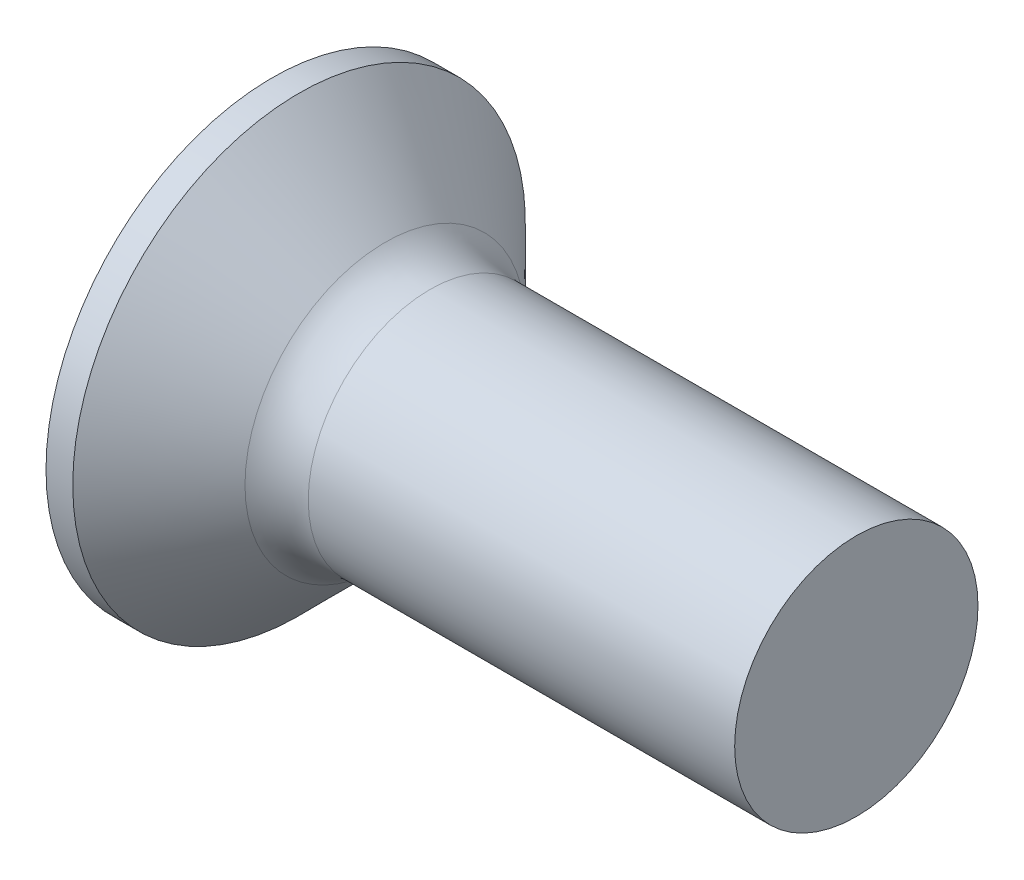
ISO-10303-21;
HEADER;
FILE_DESCRIPTION(('STEP AP214'),'2;1');
FILE_NAME('part.step','',(''),(''),'','','');
FILE_SCHEMA(('AUTOMOTIVE_DESIGN { 1 0 10303 214 1 1 1 1 }'));
ENDSEC;
DATA;
#1=APPLICATION_CONTEXT('core data for automotive mechanical design processes');
#2=APPLICATION_PROTOCOL_DEFINITION('international standard','automotive_design',2000,#1);
#3=PRODUCT_CONTEXT('',#1,'mechanical');
#4=PRODUCT('Part','Part','',(#3));
#5=PRODUCT_RELATED_PRODUCT_CATEGORY('part','',(#4));
#6=PRODUCT_DEFINITION_FORMATION('','',#4);
#7=PRODUCT_DEFINITION_CONTEXT('part definition',#1,'design');
#8=PRODUCT_DEFINITION('design','',#6,#7);
#9=PRODUCT_DEFINITION_SHAPE('','',#8);
#10=(LENGTH_UNIT() NAMED_UNIT(*) SI_UNIT(.MILLI.,.METRE.));
#11=(NAMED_UNIT(*) PLANE_ANGLE_UNIT() SI_UNIT($,.RADIAN.));
#12=(NAMED_UNIT(*) SI_UNIT($,.STERADIAN.) SOLID_ANGLE_UNIT());
#13=UNCERTAINTY_MEASURE_WITH_UNIT(LENGTH_MEASURE(1.E-05),#10,'distance_accuracy_value','');
#14=(GEOMETRIC_REPRESENTATION_CONTEXT(3) GLOBAL_UNCERTAINTY_ASSIGNED_CONTEXT((#13)) GLOBAL_UNIT_ASSIGNED_CONTEXT((#10,
#11,#12)) REPRESENTATION_CONTEXT('',''));
#15=CARTESIAN_POINT('',(0.,0.,0.));
#16=DIRECTION('',(0.,0.,1.));
#17=DIRECTION('',(1.,0.,0.));
#18=AXIS2_PLACEMENT_3D('',#15,#16,#17);
#19=CARTESIAN_POINT('',(0.,0.,0.));
#20=DIRECTION('',(-1.,0.,0.));
#21=DIRECTION('',(0.,0.,1.));
#22=AXIS2_PLACEMENT_3D('',#19,#20,#21);
#23=PLANE('',#22);
#24=CARTESIAN_POINT('',(0.,0.,0.));
#25=DIRECTION('',(-1.,0.,0.));
#26=DIRECTION('',(0.,0.,1.));
#27=AXIS2_PLACEMENT_3D('',#24,#25,#26);
#28=CIRCLE('',#27,4.65);
#29=CARTESIAN_POINT('',(0.,0.,4.65));
#30=VERTEX_POINT('',#29);
#31=EDGE_CURVE('E326',#30,#30,#28,.T.);
#32=ORIENTED_EDGE('',*,*,#31,.T.);
#33=EDGE_LOOP('',(#32));
#34=FACE_BOUND('',#33,.T.);
#35=DIRECTION('',(0.,0.,-1.));
#36=VECTOR('',#35,1.);
#37=CARTESIAN_POINT('',(0.,-0.515000000000008,2.45));
#38=LINE('',#37,#36);
#39=CARTESIAN_POINT('',(0.,-0.515000000000008,2.45));
#40=VERTEX_POINT('',#39);
#41=CARTESIAN_POINT('',(0.,-0.515000000000003,0.931375357653025));
#42=VERTEX_POINT('',#41);
#43=EDGE_CURVE('E347',#40,#42,#38,.T.);
#44=ORIENTED_EDGE('',*,*,#43,.T.);
#45=CARTESIAN_POINT('',(0.,0.,0.));
#46=DIRECTION('',(-1.,0.,0.));
#47=DIRECTION('',(0.,0.,1.));
#48=AXIS2_PLACEMENT_3D('',#45,#46,#47);
#49=CIRCLE('',#48,1.06427677642768);
#50=CARTESIAN_POINT('',(0.,-0.931375357653026,0.515));
#51=VERTEX_POINT('',#50);
#52=EDGE_CURVE('E419',#51,#42,#49,.T.);
#53=ORIENTED_EDGE('',*,*,#52,.F.);
#54=DIRECTION('',(0.,-1.,0.));
#55=VECTOR('',#54,1.);
#56=CARTESIAN_POINT('',(0.,2.45,0.515));
#57=LINE('',#56,#55);
#58=CARTESIAN_POINT('',(0.,-2.45,0.515));
#59=VERTEX_POINT('',#58);
#60=EDGE_CURVE('E298',#51,#59,#57,.T.);
#61=ORIENTED_EDGE('',*,*,#60,.T.);
#62=DIRECTION('',(0.,0.,-1.));
#63=VECTOR('',#62,1.);
#64=CARTESIAN_POINT('',(0.,-2.45,0.515));
#65=LINE('',#64,#63);
#66=CARTESIAN_POINT('',(0.,-2.45,-0.515));
#67=VERTEX_POINT('',#66);
#68=EDGE_CURVE('E281',#59,#67,#65,.T.);
#69=ORIENTED_EDGE('',*,*,#68,.T.);
#70=DIRECTION('',(0.,1.,0.));
#71=VECTOR('',#70,1.);
#72=CARTESIAN_POINT('',(0.,-2.45,-0.515));
#73=LINE('',#72,#71);
#74=CARTESIAN_POINT('',(0.,-0.931375357653026,-0.515));
#75=VERTEX_POINT('',#74);
#76=EDGE_CURVE('E290',#67,#75,#73,.T.);
#77=ORIENTED_EDGE('',*,*,#76,.T.);
#78=CARTESIAN_POINT('',(0.,-0.514999999999997,-0.931375357653028));
#79=VERTEX_POINT('',#78);
#80=EDGE_CURVE('E404',#79,#75,#49,.T.);
#81=ORIENTED_EDGE('',*,*,#80,.F.);
#82=CARTESIAN_POINT('',(0.,-0.514999999999992,-2.45));
#83=VERTEX_POINT('',#82);
#84=EDGE_CURVE('E351',#79,#83,#38,.T.);
#85=ORIENTED_EDGE('',*,*,#84,.T.);
#86=DIRECTION('',(0.,1.,0.));
#87=VECTOR('',#86,1.);
#88=CARTESIAN_POINT('',(0.,-0.514999999999992,-2.45));
#89=LINE('',#88,#87);
#90=CARTESIAN_POINT('',(0.,0.515000000000009,-2.45));
#91=VERTEX_POINT('',#90);
#92=EDGE_CURVE('E340',#83,#91,#89,.T.);
#93=ORIENTED_EDGE('',*,*,#92,.T.);
#94=DIRECTION('',(0.,0.,1.));
#95=VECTOR('',#94,1.);
#96=CARTESIAN_POINT('',(0.,0.515000000000009,-2.45));
#97=LINE('',#96,#95);
#98=CARTESIAN_POINT('',(0.,0.515000000000003,-0.931375357653025));
#99=VERTEX_POINT('',#98);
#100=EDGE_CURVE('E355',#91,#99,#97,.T.);
#101=ORIENTED_EDGE('',*,*,#100,.T.);
#102=CARTESIAN_POINT('',(0.,0.931375357653026,-0.515));
#103=VERTEX_POINT('',#102);
#104=EDGE_CURVE('E417',#103,#99,#49,.T.);
#105=ORIENTED_EDGE('',*,*,#104,.F.);
#106=CARTESIAN_POINT('',(0.,2.45,-0.515));
#107=VERTEX_POINT('',#106);
#108=EDGE_CURVE('E293',#103,#107,#73,.T.);
#109=ORIENTED_EDGE('',*,*,#108,.T.);
#110=DIRECTION('',(0.,0.,1.));
#111=VECTOR('',#110,1.);
#112=CARTESIAN_POINT('',(0.,2.45,-0.515));
#113=LINE('',#112,#111);
#114=CARTESIAN_POINT('',(0.,2.45,0.515));
#115=VERTEX_POINT('',#114);
#116=EDGE_CURVE('E292',#107,#115,#113,.T.);
#117=ORIENTED_EDGE('',*,*,#116,.T.);
#118=CARTESIAN_POINT('',(0.,0.931375357653027,0.515));
#119=VERTEX_POINT('',#118);
#120=EDGE_CURVE('E300',#115,#119,#57,.T.);
#121=ORIENTED_EDGE('',*,*,#120,.T.);
#122=CARTESIAN_POINT('',(0.,0.514999999999997,0.931375357653028));
#123=VERTEX_POINT('',#122);
#124=EDGE_CURVE('E418',#123,#119,#49,.T.);
#125=ORIENTED_EDGE('',*,*,#124,.F.);
#126=CARTESIAN_POINT('',(0.,0.514999999999991,2.45));
#127=VERTEX_POINT('',#126);
#128=EDGE_CURVE('E358',#123,#127,#97,.T.);
#129=ORIENTED_EDGE('',*,*,#128,.T.);
#130=DIRECTION('',(0.,-1.,0.));
#131=VECTOR('',#130,1.);
#132=CARTESIAN_POINT('',(0.,0.514999999999991,2.45));
#133=LINE('',#132,#131);
#134=EDGE_CURVE('E357',#127,#40,#133,.T.);
#135=ORIENTED_EDGE('',*,*,#134,.T.);
#136=EDGE_LOOP('',(#44,#53,#61,#69,#77,#81,#85,#93,#101,#105,#109,#117,#121,#125,#129,#135));
#137=FACE_BOUND('',#136,.T.);
#138=ADVANCED_FACE('F35',(#34,#137),#23,.T.);
#139=CARTESIAN_POINT('',(3.05,-0.929326147908032,0.515));
#140=DIRECTION('',(0.,0.,-1.));
#141=DIRECTION('',(0.,1.,0.));
#142=AXIS2_PLACEMENT_3D('',#139,#140,#141);
#143=PLANE('',#142);
#144=ORIENTED_EDGE('',*,*,#60,.F.);
#145=CARTESIAN_POINT('',(-1.54221347305349,-1.05291860734043,0.515));
#146=CARTESIAN_POINT('',(-1.22007147016316,-1.02783607001973,0.515));
#147=CARTESIAN_POINT('',(-0.89794181675164,-1.002592893973,0.515));
#148=CARTESIAN_POINT('',(-0.253713842852045,-0.951673528807875,0.515));
#149=CARTESIAN_POINT('',(0.0683844773279264,-0.925997335794192,0.515));
#150=CARTESIAN_POINT('',(0.712537341146252,-0.874100649412192,0.515));
#151=CARTESIAN_POINT('',(1.03459188478602,-0.847880156061489,0.515));
#152=CARTESIAN_POINT('',(1.67864013954242,-0.794723210967585,0.515));
#153=CARTESIAN_POINT('',(2.0006338510091,-0.767786763479056,0.515));
#154=CARTESIAN_POINT('',(2.56056239677505,-0.720091607539809,0.515));
#155=CARTESIAN_POINT('',(2.7985160340986,-0.699554136185312,0.515));
#156=CARTESIAN_POINT('',(3.27436149939218,-0.657782810112313,0.515));
#157=CARTESIAN_POINT('',(3.51225332755344,-0.636548957574876,0.515));
#158=CARTESIAN_POINT('',(3.98796007755392,-0.59316517097504,0.515));
#159=CARTESIAN_POINT('',(4.22577499737104,-0.571015214531953,0.515));
#160=CARTESIAN_POINT('',(4.70127802763926,-0.525368927832394,0.515));
#161=CARTESIAN_POINT('',(4.93896613655203,-0.501872581601751,0.515));
#162=CARTESIAN_POINT('',(5.17656597464715,-0.477487906778812,0.515));
#163=B_SPLINE_CURVE_WITH_KNOTS('',3,(#145,#146,#147,#148,#149,#150,#151,#152,#153,#154,#155,
#156,#157,#158,#159,#160,#161,#162),.UNSPECIFIED.,.F.,.F.,(4,2,2,2,2,2,2,2,4),(0.,
0.969351235948301,1.93871119655371,2.90807112578744,3.87742529573196,4.59393929763426,
5.3104510556289,6.0269803285681,6.74351810449256),.UNSPECIFIED.);
#164=CARTESIAN_POINT('',(3.05,-0.677477674908922,0.515));
#165=VERTEX_POINT('',#164);
#166=EDGE_CURVE('E395',#51,#165,#163,.T.);
#167=ORIENTED_EDGE('',*,*,#166,.T.);
#168=DIRECTION('',(0.,-1.,0.));
#169=VECTOR('',#168,1.);
#170=CARTESIAN_POINT('',(3.05,0.929326147908032,0.515));
#171=LINE('',#170,#169);
#172=CARTESIAN_POINT('',(3.05,-0.929326147908032,0.515));
#173=VERTEX_POINT('',#172);
#174=EDGE_CURVE('E316',#165,#173,#171,.T.);
#175=ORIENTED_EDGE('',*,*,#174,.T.);
#176=DIRECTION('',(0.89493436774996,0.446197800778958,0.));
#177=VECTOR('',#176,1.);
#178=CARTESIAN_POINT('',(0.,-2.45,0.515));
#179=LINE('',#178,#177);
#180=EDGE_CURVE('E287',#59,#173,#179,.T.);
#181=ORIENTED_EDGE('',*,*,#180,.F.);
#182=EDGE_LOOP('',(#144,#167,#175,#181));
#183=FACE_BOUND('',#182,.T.);
#184=ADVANCED_FACE('F167',(#183),#143,.T.);
#185=CARTESIAN_POINT('',(3.05,0.929326147908032,0.515));
#186=VERTEX_POINT('',#185);
#187=CARTESIAN_POINT('',(3.05,0.677477674908922,0.515));
#188=VERTEX_POINT('',#187);
#189=EDGE_CURVE('E318',#186,#188,#171,.T.);
#190=ORIENTED_EDGE('',*,*,#189,.T.);
#191=CARTESIAN_POINT('',(-1.54221347305349,1.05291860734043,0.515));
#192=CARTESIAN_POINT('',(-1.22007147016316,1.02783607001973,0.515));
#193=CARTESIAN_POINT('',(-0.89794181675164,1.002592893973,0.515));
#194=CARTESIAN_POINT('',(-0.253713842852044,0.951673528807875,0.515));
#195=CARTESIAN_POINT('',(0.068384477327927,0.925997335794193,0.515));
#196=CARTESIAN_POINT('',(0.712537341146252,0.874100649412192,0.515));
#197=CARTESIAN_POINT('',(1.03459188478602,0.84788015606149,0.515));
#198=CARTESIAN_POINT('',(1.67864013954242,0.794723210967586,0.515));
#199=CARTESIAN_POINT('',(2.0006338510091,0.767786763479056,0.515));
#200=CARTESIAN_POINT('',(2.56056239677505,0.720091607539809,0.515));
#201=CARTESIAN_POINT('',(2.7985160340986,0.699554136185312,0.515));
#202=CARTESIAN_POINT('',(3.27436149939218,0.657782810112313,0.515));
#203=CARTESIAN_POINT('',(3.51225332755344,0.636548957574876,0.515));
#204=CARTESIAN_POINT('',(3.98796007755392,0.59316517097504,0.515));
#205=CARTESIAN_POINT('',(4.22577499737104,0.571015214531953,0.515));
#206=CARTESIAN_POINT('',(4.70127802763926,0.525368927832394,0.515));
#207=CARTESIAN_POINT('',(4.93896613655203,0.501872581601751,0.515));
#208=CARTESIAN_POINT('',(5.17656597464715,0.477487906778812,0.515));
#209=B_SPLINE_CURVE_WITH_KNOTS('',3,(#191,#192,#193,#194,#195,#196,#197,#198,#199,#200,#201,
#202,#203,#204,#205,#206,#207,#208),.UNSPECIFIED.,.F.,.F.,(4,2,2,2,2,2,2,2,4),(0.,
0.969351235948301,1.93871119655371,2.90807112578744,3.87742529573196,4.59393929763426,
5.3104510556289,6.0269803285681,6.74351810449256),.UNSPECIFIED.);
#210=EDGE_CURVE('E227',#188,#119,#209,.F.);
#211=ORIENTED_EDGE('',*,*,#210,.T.);
#212=ORIENTED_EDGE('',*,*,#120,.F.);
#213=DIRECTION('',(0.89493436774996,-0.446197800778958,0.));
#214=VECTOR('',#213,1.);
#215=CARTESIAN_POINT('',(0.,2.45,0.515));
#216=LINE('',#215,#214);
#217=EDGE_CURVE('E63',#115,#186,#216,.T.);
#218=ORIENTED_EDGE('',*,*,#217,.T.);
#219=EDGE_LOOP('',(#190,#211,#212,#218));
#220=FACE_BOUND('',#219,.T.);
#221=ADVANCED_FACE('F172',(#220),#143,.T.);
#222=CARTESIAN_POINT('',(3.05,0.929326147908032,-0.515));
#223=DIRECTION('',(0.,0.,1.));
#224=DIRECTION('',(1.,0.,0.));
#225=AXIS2_PLACEMENT_3D('',#222,#223,#224);
#226=PLANE('',#225);
#227=DIRECTION('',(0.,1.,0.));
#228=VECTOR('',#227,1.);
#229=CARTESIAN_POINT('',(3.05,-0.929326147908032,-0.515));
#230=LINE('',#229,#228);
#231=CARTESIAN_POINT('',(3.05,-0.929326147908032,-0.515));
#232=VERTEX_POINT('',#231);
#233=CARTESIAN_POINT('',(3.05,-0.677477674908922,-0.515));
#234=VERTEX_POINT('',#233);
#235=EDGE_CURVE('E317',#232,#234,#230,.T.);
#236=ORIENTED_EDGE('',*,*,#235,.T.);
#237=CARTESIAN_POINT('',(-1.54221347058903,-1.05291860714859,-0.515));
#238=CARTESIAN_POINT('',(-1.22007146800241,-1.02783606985067,-0.515));
#239=CARTESIAN_POINT('',(-0.897941814894598,-1.00259289382691,-0.515));
#240=CARTESIAN_POINT('',(-0.253713841602368,-0.951673528708394,-0.515));
#241=CARTESIAN_POINT('',(0.0683844782739385,-0.925997335718345,-0.515));
#242=CARTESIAN_POINT('',(0.712537341258934,-0.874100649402747,-0.515));
#243=CARTESIAN_POINT('',(1.03459188436907,-0.847880156095195,-0.515));
#244=CARTESIAN_POINT('',(1.67864013806642,-0.794723211090119,-0.515));
#245=CARTESIAN_POINT('',(2.00063384900369,-0.767786763647266,-0.515));
#246=CARTESIAN_POINT('',(2.56056239424054,-0.720091607757629,-0.515));
#247=CARTESIAN_POINT('',(2.79851603156427,-0.699554136405275,-0.515));
#248=CARTESIAN_POINT('',(3.27436149685826,-0.657782810337245,-0.515));
#249=CARTESIAN_POINT('',(3.51225332501977,-0.636548957802634,-0.515));
#250=CARTESIAN_POINT('',(3.98796007502083,-0.593165171209449,-0.515));
#251=CARTESIAN_POINT('',(4.22577499483828,-0.571015214770186,-0.515));
#252=CARTESIAN_POINT('',(4.70127802510735,-0.525368928080089,-0.515));
#253=CARTESIAN_POINT('',(4.93896613402064,-0.501872581855082,-0.515));
#254=CARTESIAN_POINT('',(5.17656597211643,-0.477487907039094,-0.515));
#255=B_SPLINE_CURVE_WITH_KNOTS('',3,(#237,#238,#239,#240,#241,#242,#243,#244,#245,#246,#247,
#248,#249,#250,#251,#252,#253,#254),.UNSPECIFIED.,.F.,.F.,(4,2,2,2,2,2,2,2,4),(0.,
0.969351235034601,1.93871119472626,2.90807112236582,3.87742529071622,4.59393929261848,
5.3104510506131,6.02698032355223,6.74351809947659),.UNSPECIFIED.);
#256=EDGE_CURVE('E221',#234,#75,#255,.F.);
#257=ORIENTED_EDGE('',*,*,#256,.T.);
#258=ORIENTED_EDGE('',*,*,#76,.F.);
#259=DIRECTION('',(0.89493436774996,0.446197800778958,0.));
#260=VECTOR('',#259,1.);
#261=CARTESIAN_POINT('',(0.,-2.45,-0.515));
#262=LINE('',#261,#260);
#263=EDGE_CURVE('E277',#67,#232,#262,.T.);
#264=ORIENTED_EDGE('',*,*,#263,.T.);
#265=EDGE_LOOP('',(#236,#257,#258,#264));
#266=FACE_BOUND('',#265,.T.);
#267=ADVANCED_FACE('F207',(#266),#226,.T.);
#268=ORIENTED_EDGE('',*,*,#108,.F.);
#269=CARTESIAN_POINT('',(-1.54221347058903,1.05291860714859,-0.515));
#270=CARTESIAN_POINT('',(-1.22007146800241,1.02783606985067,-0.515));
#271=CARTESIAN_POINT('',(-0.897941814894599,1.00259289382691,-0.515));
#272=CARTESIAN_POINT('',(-0.253713841602368,0.951673528708394,-0.515));
#273=CARTESIAN_POINT('',(0.0683844782739385,0.925997335718345,-0.515));
#274=CARTESIAN_POINT('',(0.712537341258934,0.874100649402747,-0.515));
#275=CARTESIAN_POINT('',(1.03459188436907,0.847880156095195,-0.515));
#276=CARTESIAN_POINT('',(1.67864013806642,0.794723211090119,-0.515));
#277=CARTESIAN_POINT('',(2.00063384900369,0.767786763647266,-0.515));
#278=CARTESIAN_POINT('',(2.56056239424054,0.720091607757629,-0.515));
#279=CARTESIAN_POINT('',(2.79851603156427,0.699554136405275,-0.515));
#280=CARTESIAN_POINT('',(3.27436149685826,0.657782810337245,-0.515));
#281=CARTESIAN_POINT('',(3.51225332501977,0.636548957802634,-0.515));
#282=CARTESIAN_POINT('',(3.98796007502083,0.593165171209449,-0.515));
#283=CARTESIAN_POINT('',(4.22577499483828,0.571015214770186,-0.515));
#284=CARTESIAN_POINT('',(4.70127802510735,0.525368928080089,-0.515));
#285=CARTESIAN_POINT('',(4.93896613402064,0.501872581855082,-0.515));
#286=CARTESIAN_POINT('',(5.17656597211643,0.477487907039095,-0.515));
#287=B_SPLINE_CURVE_WITH_KNOTS('',3,(#269,#270,#271,#272,#273,#274,#275,#276,#277,#278,#279,
#280,#281,#282,#283,#284,#285,#286),.UNSPECIFIED.,.F.,.F.,(4,2,2,2,2,2,2,2,4),(0.,
0.9693512350346,1.93871119472626,2.90807112236583,3.87742529071622,4.59393929261848,
5.3104510506131,6.02698032355223,6.74351809947659),.UNSPECIFIED.);
#288=CARTESIAN_POINT('',(3.05,0.677477674908922,-0.515));
#289=VERTEX_POINT('',#288);
#290=EDGE_CURVE('E215',#103,#289,#287,.T.);
#291=ORIENTED_EDGE('',*,*,#290,.T.);
#292=CARTESIAN_POINT('',(3.05,0.929326147908032,-0.515));
#293=VERTEX_POINT('',#292);
#294=EDGE_CURVE('E322',#289,#293,#230,.T.);
#295=ORIENTED_EDGE('',*,*,#294,.T.);
#296=DIRECTION('',(0.89493436774996,-0.446197800778958,0.));
#297=VECTOR('',#296,1.);
#298=CARTESIAN_POINT('',(0.,2.45,-0.515));
#299=LINE('',#298,#297);
#300=EDGE_CURVE('E311',#107,#293,#299,.T.);
#301=ORIENTED_EDGE('',*,*,#300,.F.);
#302=EDGE_LOOP('',(#268,#291,#295,#301));
#303=FACE_BOUND('',#302,.T.);
#304=ADVANCED_FACE('F199',(#303),#226,.T.);
#305=CARTESIAN_POINT('',(3.05,0.929326147908032,-0.515));
#306=DIRECTION('',(1.,0.,0.));
#307=DIRECTION('',(0.,0.,-1.));
#308=AXIS2_PLACEMENT_3D('',#305,#306,#307);
#309=PLANE('',#308);
#310=CARTESIAN_POINT('',(3.05,0.,0.));
#311=DIRECTION('',(-1.,0.,0.));
#312=DIRECTION('',(0.,0.,1.));
#313=AXIS2_PLACEMENT_3D('',#310,#311,#312);
#314=CIRCLE('',#313,0.851);
#315=EDGE_CURVE('E426',#234,#165,#314,.T.);
#316=ORIENTED_EDGE('',*,*,#315,.F.);
#317=ORIENTED_EDGE('',*,*,#235,.F.);
#318=DIRECTION('',(0.,0.,-1.));
#319=VECTOR('',#318,1.);
#320=CARTESIAN_POINT('',(3.05,-0.929326147908032,0.515));
#321=LINE('',#320,#319);
#322=EDGE_CURVE('E284',#173,#232,#321,.T.);
#323=ORIENTED_EDGE('',*,*,#322,.F.);
#324=ORIENTED_EDGE('',*,*,#174,.F.);
#325=EDGE_LOOP('',(#316,#317,#323,#324));
#326=FACE_BOUND('',#325,.T.);
#327=ADVANCED_FACE('F195',(#326),#309,.F.);
#328=CARTESIAN_POINT('',(3.05,-0.515000000000002,0.67747767490892));
#329=VERTEX_POINT('',#328);
#330=CARTESIAN_POINT('',(3.05,0.514999999999998,0.677477674908923));
#331=VERTEX_POINT('',#330);
#332=EDGE_CURVE('E421',#329,#331,#314,.T.);
#333=ORIENTED_EDGE('',*,*,#332,.F.);
#334=DIRECTION('',(0.,0.,-1.));
#335=VECTOR('',#334,1.);
#336=CARTESIAN_POINT('',(3.05,-0.515000000000003,0.92932614790803));
#337=LINE('',#336,#335);
#338=CARTESIAN_POINT('',(3.05,-0.515000000000003,0.92932614790803));
#339=VERTEX_POINT('',#338);
#340=EDGE_CURVE('E376',#339,#329,#337,.T.);
#341=ORIENTED_EDGE('',*,*,#340,.F.);
#342=DIRECTION('',(0.,-1.,0.));
#343=VECTOR('',#342,1.);
#344=CARTESIAN_POINT('',(3.05,0.514999999999997,0.929326147908034));
#345=LINE('',#344,#343);
#346=CARTESIAN_POINT('',(3.05,0.514999999999997,0.929326147908034));
#347=VERTEX_POINT('',#346);
#348=EDGE_CURVE('E371',#347,#339,#345,.T.);
#349=ORIENTED_EDGE('',*,*,#348,.F.);
#350=DIRECTION('',(0.,0.,1.));
#351=VECTOR('',#350,1.);
#352=CARTESIAN_POINT('',(3.05,0.515000000000003,-0.92932614790803));
#353=LINE('',#352,#351);
#354=EDGE_CURVE('E381',#331,#347,#353,.T.);
#355=ORIENTED_EDGE('',*,*,#354,.F.);
#356=EDGE_LOOP('',(#333,#341,#349,#355));
#357=FACE_BOUND('',#356,.T.);
#358=ADVANCED_FACE('F198',(#357),#309,.F.);
#359=EDGE_CURVE('E392',#188,#289,#314,.T.);
#360=ORIENTED_EDGE('',*,*,#359,.F.);
#361=ORIENTED_EDGE('',*,*,#189,.F.);
#362=DIRECTION('',(0.,0.,1.));
#363=VECTOR('',#362,1.);
#364=CARTESIAN_POINT('',(3.05,0.929326147908032,-0.515));
#365=LINE('',#364,#363);
#366=EDGE_CURVE('E314',#293,#186,#365,.T.);
#367=ORIENTED_EDGE('',*,*,#366,.F.);
#368=ORIENTED_EDGE('',*,*,#294,.F.);
#369=EDGE_LOOP('',(#360,#361,#367,#368));
#370=FACE_BOUND('',#369,.T.);
#371=ADVANCED_FACE('F389',(#370),#309,.F.);
#372=CARTESIAN_POINT('',(3.05,0.515000000000002,-0.67747767490892));
#373=VERTEX_POINT('',#372);
#374=CARTESIAN_POINT('',(3.05,-0.514999999999998,-0.677477674908924));
#375=VERTEX_POINT('',#374);
#376=EDGE_CURVE('E416',#373,#375,#314,.T.);
#377=ORIENTED_EDGE('',*,*,#376,.F.);
#378=CARTESIAN_POINT('',(3.05,0.515000000000003,-0.92932614790803));
#379=VERTEX_POINT('',#378);
#380=EDGE_CURVE('E375',#379,#373,#353,.T.);
#381=ORIENTED_EDGE('',*,*,#380,.F.);
#382=DIRECTION('',(0.,1.,0.));
#383=VECTOR('',#382,1.);
#384=CARTESIAN_POINT('',(3.05,-0.514999999999997,-0.929326147908034));
#385=LINE('',#384,#383);
#386=CARTESIAN_POINT('',(3.05,-0.514999999999997,-0.929326147908034));
#387=VERTEX_POINT('',#386);
#388=EDGE_CURVE('E370',#387,#379,#385,.T.);
#389=ORIENTED_EDGE('',*,*,#388,.F.);
#390=EDGE_CURVE('E374',#375,#387,#337,.T.);
#391=ORIENTED_EDGE('',*,*,#390,.F.);
#392=EDGE_LOOP('',(#377,#381,#389,#391));
#393=FACE_BOUND('',#392,.T.);
#394=ADVANCED_FACE('F201',(#393),#309,.F.);
#395=CARTESIAN_POINT('',(3.05,0.514999999999997,0.929326147908034));
#396=DIRECTION('',(0.,-1.,0.));
#397=DIRECTION('',(1.,0.,0.));
#398=AXIS2_PLACEMENT_3D('',#395,#396,#397);
#399=PLANE('',#398);
#400=ORIENTED_EDGE('',*,*,#380,.T.);
#401=CARTESIAN_POINT('',(-1.54221347058903,0.515000000000004,-1.05291860714859));
#402=CARTESIAN_POINT('',(-1.22007146800241,0.515000000000003,-1.02783606985067));
#403=CARTESIAN_POINT('',(-0.897941814894599,0.515000000000003,-1.00259289382691));
#404=CARTESIAN_POINT('',(-0.253713841602368,0.515000000000003,-0.951673528708393));
#405=CARTESIAN_POINT('',(0.0683844782739385,0.515000000000003,-0.925997335718343));
#406=CARTESIAN_POINT('',(0.712537341258934,0.515000000000003,-0.874100649402745));
#407=CARTESIAN_POINT('',(1.03459188436907,0.515000000000003,-0.847880156095194));
#408=CARTESIAN_POINT('',(1.67864013806642,0.515000000000003,-0.794723211090117));
#409=CARTESIAN_POINT('',(2.00063384900369,0.515000000000003,-0.767786763647265));
#410=CARTESIAN_POINT('',(2.56056239424054,0.515000000000003,-0.720091607757627));
#411=CARTESIAN_POINT('',(2.79851603156427,0.515000000000003,-0.699554136405273));
#412=CARTESIAN_POINT('',(3.27436149685826,0.515000000000002,-0.657782810337243));
#413=CARTESIAN_POINT('',(3.51225332501977,0.515000000000002,-0.636548957802633));
#414=CARTESIAN_POINT('',(3.98796007502083,0.515000000000002,-0.593165171209447));
#415=CARTESIAN_POINT('',(4.22577499483828,0.515000000000002,-0.571015214770184));
#416=CARTESIAN_POINT('',(4.70127802510735,0.515000000000002,-0.525368928080087));
#417=CARTESIAN_POINT('',(4.93896613402064,0.515000000000002,-0.50187258185508));
#418=CARTESIAN_POINT('',(5.17656597211643,0.515000000000002,-0.477487907039093));
#419=B_SPLINE_CURVE_WITH_KNOTS('',3,(#401,#402,#403,#404,#405,#406,#407,#408,#409,#410,#411,
#412,#413,#414,#415,#416,#417,#418),.UNSPECIFIED.,.F.,.F.,(4,2,2,2,2,2,2,2,4),(0.,
0.969351235034601,1.93871119472626,2.90807112236582,3.87742529071622,4.59393929261848,
5.3104510506131,6.02698032355223,6.74351809947659),.UNSPECIFIED.);
#420=EDGE_CURVE('E252',#373,#99,#419,.F.);
#421=ORIENTED_EDGE('',*,*,#420,.T.);
#422=ORIENTED_EDGE('',*,*,#100,.F.);
#423=DIRECTION('',(0.89493436774996,0.,0.446197800778958));
#424=VECTOR('',#423,1.);
#425=CARTESIAN_POINT('',(0.,0.515000000000009,-2.45));
#426=LINE('',#425,#424);
#427=EDGE_CURVE('E362',#91,#379,#426,.T.);
#428=ORIENTED_EDGE('',*,*,#427,.T.);
#429=EDGE_LOOP('',(#400,#421,#422,#428));
#430=FACE_BOUND('',#429,.T.);
#431=ADVANCED_FACE('F258',(#430),#399,.T.);
#432=CARTESIAN_POINT('',(3.05,-0.514999999999997,-0.929326147908034));
#433=DIRECTION('',(0.,1.,0.));
#434=DIRECTION('',(0.,0.,1.));
#435=AXIS2_PLACEMENT_3D('',#432,#433,#434);
#436=PLANE('',#435);
#437=ORIENTED_EDGE('',*,*,#84,.F.);
#438=CARTESIAN_POINT('',(-1.54221347305349,-0.514999999999996,-1.05291860734043));
#439=CARTESIAN_POINT('',(-1.22007147016316,-0.514999999999996,-1.02783607001974));
#440=CARTESIAN_POINT('',(-0.89794181675164,-0.514999999999997,-1.002592893973));
#441=CARTESIAN_POINT('',(-0.253713842852044,-0.514999999999997,-0.951673528807877));
#442=CARTESIAN_POINT('',(0.0683844773279268,-0.514999999999997,-0.925997335794194));
#443=CARTESIAN_POINT('',(0.712537341146252,-0.514999999999997,-0.874100649412194));
#444=CARTESIAN_POINT('',(1.03459188478602,-0.514999999999997,-0.847880156061491));
#445=CARTESIAN_POINT('',(1.67864013954242,-0.514999999999997,-0.794723210967587));
#446=CARTESIAN_POINT('',(2.0006338510091,-0.514999999999997,-0.767786763479058));
#447=CARTESIAN_POINT('',(2.56056239677505,-0.514999999999998,-0.72009160753981));
#448=CARTESIAN_POINT('',(2.7985160340986,-0.514999999999998,-0.699554136185314));
#449=CARTESIAN_POINT('',(3.27436149939218,-0.514999999999998,-0.657782810112315));
#450=CARTESIAN_POINT('',(3.51225332755344,-0.514999999999998,-0.636548957574878));
#451=CARTESIAN_POINT('',(3.98796007755392,-0.514999999999998,-0.593165170975042));
#452=CARTESIAN_POINT('',(4.22577499737104,-0.514999999999998,-0.571015214531955));
#453=CARTESIAN_POINT('',(4.70127802763926,-0.514999999999998,-0.525368927832396));
#454=CARTESIAN_POINT('',(4.93896613655203,-0.514999999999999,-0.501872581601752));
#455=CARTESIAN_POINT('',(5.17656597464715,-0.514999999999999,-0.477487906778814));
#456=B_SPLINE_CURVE_WITH_KNOTS('',3,(#438,#439,#440,#441,#442,#443,#444,#445,#446,#447,#448,
#449,#450,#451,#452,#453,#454,#455),.UNSPECIFIED.,.F.,.F.,(4,2,2,2,2,2,2,2,4),(0.,
0.969351235948301,1.93871119655371,2.90807112578744,3.87742529573196,4.59393929763426,
5.3104510556289,6.0269803285681,6.74351810449256),.UNSPECIFIED.);
#457=EDGE_CURVE('E247',#79,#375,#456,.T.);
#458=ORIENTED_EDGE('',*,*,#457,.T.);
#459=ORIENTED_EDGE('',*,*,#390,.T.);
#460=DIRECTION('',(0.89493436774996,0.,0.446197800778958));
#461=VECTOR('',#460,1.);
#462=CARTESIAN_POINT('',(0.,-0.514999999999992,-2.45));
#463=LINE('',#462,#461);
#464=EDGE_CURVE('E359',#83,#387,#463,.T.);
#465=ORIENTED_EDGE('',*,*,#464,.F.);
#466=EDGE_LOOP('',(#437,#458,#459,#465));
#467=FACE_BOUND('',#466,.T.);
#468=ADVANCED_FACE('F262',(#467),#436,.T.);
#469=ORIENTED_EDGE('',*,*,#340,.T.);
#470=CARTESIAN_POINT('',(-1.54221347305349,-0.515000000000003,1.05291860734043));
#471=CARTESIAN_POINT('',(-1.22007147016316,-0.515000000000003,1.02783607001973));
#472=CARTESIAN_POINT('',(-0.89794181675164,-0.515000000000003,1.002592893973));
#473=CARTESIAN_POINT('',(-0.253713842852045,-0.515000000000003,0.951673528807873));
#474=CARTESIAN_POINT('',(0.0683844773279266,-0.515000000000003,0.925997335794191));
#475=CARTESIAN_POINT('',(0.712537341146252,-0.515000000000003,0.87410064941219));
#476=CARTESIAN_POINT('',(1.03459188478602,-0.515000000000003,0.847880156061488));
#477=CARTESIAN_POINT('',(1.67864013954242,-0.515000000000003,0.794723210967584));
#478=CARTESIAN_POINT('',(2.0006338510091,-0.515000000000003,0.767786763479054));
#479=CARTESIAN_POINT('',(2.56056239677505,-0.515000000000002,0.720091607539807));
#480=CARTESIAN_POINT('',(2.7985160340986,-0.515000000000002,0.699554136185311));
#481=CARTESIAN_POINT('',(3.27436149939218,-0.515000000000002,0.657782810112311));
#482=CARTESIAN_POINT('',(3.51225332755344,-0.515000000000002,0.636548957574875));
#483=CARTESIAN_POINT('',(3.98796007755392,-0.515000000000002,0.593165170975039));
#484=CARTESIAN_POINT('',(4.22577499737104,-0.515000000000002,0.571015214531952));
#485=CARTESIAN_POINT('',(4.70127802763926,-0.515000000000002,0.525368927832393));
#486=CARTESIAN_POINT('',(4.93896613655203,-0.515000000000002,0.501872581601749));
#487=CARTESIAN_POINT('',(5.17656597464715,-0.515000000000002,0.47748790677881));
#488=B_SPLINE_CURVE_WITH_KNOTS('',3,(#470,#471,#472,#473,#474,#475,#476,#477,#478,#479,#480,
#481,#482,#483,#484,#485,#486,#487),.UNSPECIFIED.,.F.,.F.,(4,2,2,2,2,2,2,2,4),(0.,
0.969351235948301,1.93871119655371,2.90807112578744,3.87742529573196,4.59393929763426,
5.3104510556289,6.0269803285681,6.74351810449256),.UNSPECIFIED.);
#489=EDGE_CURVE('E240',#329,#42,#488,.F.);
#490=ORIENTED_EDGE('',*,*,#489,.T.);
#491=ORIENTED_EDGE('',*,*,#43,.F.);
#492=DIRECTION('',(0.89493436774996,0.,-0.446197800778958));
#493=VECTOR('',#492,1.);
#494=CARTESIAN_POINT('',(0.,-0.515000000000008,2.45));
#495=LINE('',#494,#493);
#496=EDGE_CURVE('E365',#40,#339,#495,.T.);
#497=ORIENTED_EDGE('',*,*,#496,.T.);
#498=EDGE_LOOP('',(#469,#490,#491,#497));
#499=FACE_BOUND('',#498,.T.);
#500=ADVANCED_FACE('F445',(#499),#436,.T.);
#501=ORIENTED_EDGE('',*,*,#128,.F.);
#502=CARTESIAN_POINT('',(-1.54221347058903,0.514999999999996,1.05291860714859));
#503=CARTESIAN_POINT('',(-1.22007146800242,0.514999999999996,1.02783606985067));
#504=CARTESIAN_POINT('',(-0.897941814894599,0.514999999999996,1.00259289382691));
#505=CARTESIAN_POINT('',(-0.253713841602368,0.514999999999997,0.951673528708396));
#506=CARTESIAN_POINT('',(0.0683844782739387,0.514999999999997,0.925997335718347));
#507=CARTESIAN_POINT('',(0.712537341258934,0.514999999999997,0.874100649402748));
#508=CARTESIAN_POINT('',(1.03459188436907,0.514999999999997,0.847880156095197));
#509=CARTESIAN_POINT('',(1.67864013806642,0.514999999999997,0.794723211090121));
#510=CARTESIAN_POINT('',(2.00063384900369,0.514999999999997,0.767786763647268));
#511=CARTESIAN_POINT('',(2.56056239424054,0.514999999999998,0.720091607757631));
#512=CARTESIAN_POINT('',(2.79851603156427,0.514999999999998,0.699554136405277));
#513=CARTESIAN_POINT('',(3.27436149685826,0.514999999999998,0.657782810337247));
#514=CARTESIAN_POINT('',(3.51225332501977,0.514999999999998,0.636548957802636));
#515=CARTESIAN_POINT('',(3.98796007502083,0.514999999999998,0.593165171209451));
#516=CARTESIAN_POINT('',(4.22577499483828,0.514999999999998,0.571015214770188));
#517=CARTESIAN_POINT('',(4.70127802510735,0.514999999999998,0.525368928080091));
#518=CARTESIAN_POINT('',(4.93896613402064,0.514999999999998,0.501872581855084));
#519=CARTESIAN_POINT('',(5.17656597211643,0.514999999999998,0.477487907039096));
#520=B_SPLINE_CURVE_WITH_KNOTS('',3,(#502,#503,#504,#505,#506,#507,#508,#509,#510,#511,#512,
#513,#514,#515,#516,#517,#518,#519),.UNSPECIFIED.,.F.,.F.,(4,2,2,2,2,2,2,2,4),(0.,
0.9693512350346,1.93871119472626,2.90807112236583,3.87742529071622,4.59393929261848,
5.3104510506131,6.02698032355223,6.74351809947659),.UNSPECIFIED.);
#521=EDGE_CURVE('E11',#123,#331,#520,.T.);
#522=ORIENTED_EDGE('',*,*,#521,.T.);
#523=ORIENTED_EDGE('',*,*,#354,.T.);
#524=DIRECTION('',(0.89493436774996,0.,-0.446197800778958));
#525=VECTOR('',#524,1.);
#526=CARTESIAN_POINT('',(0.,0.514999999999991,2.45));
#527=LINE('',#526,#525);
#528=EDGE_CURVE('E367',#127,#347,#527,.T.);
#529=ORIENTED_EDGE('',*,*,#528,.F.);
#530=EDGE_LOOP('',(#501,#522,#523,#529));
#531=FACE_BOUND('',#530,.T.);
#532=ADVANCED_FACE('F182',(#531),#399,.T.);
#533=CARTESIAN_POINT('',(-6.34999999999999,0.,0.));
#534=DIRECTION('',(-1.,0.,0.));
#535=DIRECTION('',(0.,0.,1.));
#536=AXIS2_PLACEMENT_3D('',#533,#534,#535);
#537=CYLINDRICAL_SURFACE('',#536,4.65);
#538=CARTESIAN_POINT('',(0.550000000000008,0.,0.));
#539=DIRECTION('',(-1.,0.,0.));
#540=DIRECTION('',(0.,0.,1.));
#541=AXIS2_PLACEMENT_3D('',#538,#539,#540);
#542=CIRCLE('',#541,4.65);
#543=CARTESIAN_POINT('',(0.550000000000008,0.,4.65));
#544=VERTEX_POINT('',#543);
#545=EDGE_CURVE('E303',#544,#544,#542,.T.);
#546=ORIENTED_EDGE('',*,*,#545,.T.);
#547=EDGE_LOOP('',(#546));
#548=FACE_BOUND('',#547,.T.);
#549=ORIENTED_EDGE('',*,*,#31,.F.);
#550=EDGE_LOOP('',(#549));
#551=FACE_BOUND('',#550,.T.);
#552=ADVANCED_FACE('F178',(#548,#551),#537,.T.);
#553=CARTESIAN_POINT('',(0.550000000000008,0.,0.));
#554=DIRECTION('',(-1.,0.,0.));
#555=DIRECTION('',(0.,0.,1.));
#556=AXIS2_PLACEMENT_3D('',#553,#554,#555);
#557=CONICAL_SURFACE('',#556,4.65,0.78539816339745);
#558=CARTESIAN_POINT('',(2.31923881554251,0.,0.));
#559=DIRECTION('',(-1.,0.,0.));
#560=DIRECTION('',(0.,0.,1.));
#561=AXIS2_PLACEMENT_3D('',#558,#559,#560);
#562=CIRCLE('',#561,2.88076118445749);
#563=CARTESIAN_POINT('',(2.31923881554251,0.,2.88076118445749));
#564=VERTEX_POINT('',#563);
#565=EDGE_CURVE('E328',#564,#564,#562,.T.);
#566=ORIENTED_EDGE('',*,*,#565,.T.);
#567=EDGE_LOOP('',(#566));
#568=FACE_BOUND('',#567,.T.);
#569=ORIENTED_EDGE('',*,*,#545,.F.);
#570=EDGE_LOOP('',(#569));
#571=FACE_BOUND('',#570,.T.);
#572=ADVANCED_FACE('F181',(#568,#571),#557,.T.);
#573=CARTESIAN_POINT('',(-6.34999999999999,0.,0.));
#574=DIRECTION('',(-1.,0.,0.));
#575=DIRECTION('',(0.,0.,1.));
#576=AXIS2_PLACEMENT_3D('',#573,#574,#575);
#577=CYLINDRICAL_SURFACE('',#576,2.5);
#578=CARTESIAN_POINT('',(3.23847763108502,0.,0.));
#579=DIRECTION('',(-1.,0.,0.));
#580=DIRECTION('',(0.,0.,1.));
#581=AXIS2_PLACEMENT_3D('',#578,#579,#580);
#582=CIRCLE('',#581,2.5);
#583=CARTESIAN_POINT('',(3.23847763108502,0.,2.5));
#584=VERTEX_POINT('',#583);
#585=EDGE_CURVE('E48',#584,#584,#582,.F.);
#586=ORIENTED_EDGE('',*,*,#585,.T.);
#587=EDGE_LOOP('',(#586));
#588=FACE_BOUND('',#587,.T.);
#589=CARTESIAN_POINT('',(12.,0.,0.));
#590=DIRECTION('',(-1.,0.,0.));
#591=DIRECTION('',(0.,0.,1.));
#592=AXIS2_PLACEMENT_3D('',#589,#590,#591);
#593=CIRCLE('',#592,2.5);
#594=CARTESIAN_POINT('',(12.,0.,2.5));
#595=VERTEX_POINT('',#594);
#596=EDGE_CURVE('E299',#595,#595,#593,.T.);
#597=ORIENTED_EDGE('',*,*,#596,.T.);
#598=EDGE_LOOP('',(#597));
#599=FACE_BOUND('',#598,.T.);
#600=ADVANCED_FACE('F186',(#588,#599),#577,.T.);
#601=CARTESIAN_POINT('',(12.,2.5,0.));
#602=DIRECTION('',(1.,0.,0.));
#603=DIRECTION('',(0.,0.,-1.));
#604=AXIS2_PLACEMENT_3D('',#601,#602,#603);
#605=PLANE('',#604);
#606=ORIENTED_EDGE('',*,*,#596,.F.);
#607=EDGE_LOOP('',(#606));
#608=FACE_BOUND('',#607,.T.);
#609=ADVANCED_FACE('F190',(#608),#605,.T.);
#610=CARTESIAN_POINT('',(3.23847763108503,0.,0.));
#611=DIRECTION('',(-1.,0.,0.));
#612=DIRECTION('',(0.,0.,1.));
#613=AXIS2_PLACEMENT_3D('',#610,#611,#612);
#614=TOROIDAL_SURFACE('',#613,3.8,1.3);
#615=ORIENTED_EDGE('',*,*,#585,.F.);
#616=EDGE_LOOP('',(#615));
#617=FACE_BOUND('',#616,.T.);
#618=ORIENTED_EDGE('',*,*,#565,.F.);
#619=EDGE_LOOP('',(#618));
#620=FACE_BOUND('',#619,.T.);
#621=ADVANCED_FACE('F37',(#617,#620),#614,.F.);
#622=CARTESIAN_POINT('',(3.05,-0.929326147908032,-0.515));
#623=DIRECTION('',(-0.446197800778958,0.89493436774996,0.));
#624=DIRECTION('',(-0.89493436774996,-0.446197800778958,0.));
#625=AXIS2_PLACEMENT_3D('',#622,#623,#624);
#626=PLANE('',#625);
#627=ORIENTED_EDGE('',*,*,#263,.F.);
#628=ORIENTED_EDGE('',*,*,#68,.F.);
#629=ORIENTED_EDGE('',*,*,#180,.T.);
#630=ORIENTED_EDGE('',*,*,#322,.T.);
#631=EDGE_LOOP('',(#627,#628,#629,#630));
#632=FACE_BOUND('',#631,.T.);
#633=ADVANCED_FACE('F206',(#632),#626,.T.);
#634=CARTESIAN_POINT('',(3.05,0.929326147908032,0.515));
#635=DIRECTION('',(-0.446197800778958,-0.89493436774996,0.));
#636=DIRECTION('',(0.89493436774996,-0.446197800778958,0.));
#637=AXIS2_PLACEMENT_3D('',#634,#635,#636);
#638=PLANE('',#637);
#639=ORIENTED_EDGE('',*,*,#217,.F.);
#640=ORIENTED_EDGE('',*,*,#116,.F.);
#641=ORIENTED_EDGE('',*,*,#300,.T.);
#642=ORIENTED_EDGE('',*,*,#366,.T.);
#643=EDGE_LOOP('',(#639,#640,#641,#642));
#644=FACE_BOUND('',#643,.T.);
#645=ADVANCED_FACE('F202',(#644),#638,.T.);
#646=CARTESIAN_POINT('',(3.05,0.515000000000003,-0.92932614790803));
#647=DIRECTION('',(-0.446197800778958,0.,0.89493436774996));
#648=DIRECTION('',(-0.89493436774996,0.,-0.446197800778958));
#649=AXIS2_PLACEMENT_3D('',#646,#647,#648);
#650=PLANE('',#649);
#651=ORIENTED_EDGE('',*,*,#427,.F.);
#652=ORIENTED_EDGE('',*,*,#92,.F.);
#653=ORIENTED_EDGE('',*,*,#464,.T.);
#654=ORIENTED_EDGE('',*,*,#388,.T.);
#655=EDGE_LOOP('',(#651,#652,#653,#654));
#656=FACE_BOUND('',#655,.T.);
#657=ADVANCED_FACE('F205',(#656),#650,.T.);
#658=CARTESIAN_POINT('',(3.05,-0.515000000000003,0.92932614790803));
#659=DIRECTION('',(-0.446197800778958,0.,-0.89493436774996));
#660=DIRECTION('',(0.89493436774996,0.,-0.446197800778958));
#661=AXIS2_PLACEMENT_3D('',#658,#659,#660);
#662=PLANE('',#661);
#663=ORIENTED_EDGE('',*,*,#496,.F.);
#664=ORIENTED_EDGE('',*,*,#134,.F.);
#665=ORIENTED_EDGE('',*,*,#528,.T.);
#666=ORIENTED_EDGE('',*,*,#348,.T.);
#667=EDGE_LOOP('',(#663,#664,#665,#666));
#668=FACE_BOUND('',#667,.T.);
#669=ADVANCED_FACE('F265',(#668),#662,.T.);
#670=CARTESIAN_POINT('',(3.05,0.,0.));
#671=DIRECTION('',(-1.,0.,0.));
#672=DIRECTION('',(0.,0.,1.));
#673=AXIS2_PLACEMENT_3D('',#670,#671,#672);
#674=CONICAL_SURFACE('',#673,0.851,0.069813170079766);
#675=ORIENTED_EDGE('',*,*,#52,.T.);
#676=ORIENTED_EDGE('',*,*,#489,.F.);
#677=EDGE_CURVE('E423',#165,#329,#314,.T.);
#678=ORIENTED_EDGE('',*,*,#677,.F.);
#679=ORIENTED_EDGE('',*,*,#166,.F.);
#680=EDGE_LOOP('',(#675,#676,#678,#679));
#681=FACE_BOUND('',#680,.T.);
#682=ADVANCED_FACE('F165',(#681),#674,.F.);
#683=EDGE_CURVE('E55',#331,#188,#314,.T.);
#684=ORIENTED_EDGE('',*,*,#683,.F.);
#685=ORIENTED_EDGE('',*,*,#521,.F.);
#686=ORIENTED_EDGE('',*,*,#124,.T.);
#687=ORIENTED_EDGE('',*,*,#210,.F.);
#688=EDGE_LOOP('',(#684,#685,#686,#687));
#689=FACE_BOUND('',#688,.T.);
#690=ADVANCED_FACE('F433',(#689),#674,.F.);
#691=ORIENTED_EDGE('',*,*,#104,.T.);
#692=ORIENTED_EDGE('',*,*,#420,.F.);
#693=EDGE_CURVE('E422',#289,#373,#314,.T.);
#694=ORIENTED_EDGE('',*,*,#693,.F.);
#695=ORIENTED_EDGE('',*,*,#290,.F.);
#696=EDGE_LOOP('',(#691,#692,#694,#695));
#697=FACE_BOUND('',#696,.T.);
#698=ADVANCED_FACE('F163',(#697),#674,.F.);
#699=EDGE_CURVE('E428',#375,#234,#314,.T.);
#700=ORIENTED_EDGE('',*,*,#699,.F.);
#701=ORIENTED_EDGE('',*,*,#457,.F.);
#702=ORIENTED_EDGE('',*,*,#80,.T.);
#703=ORIENTED_EDGE('',*,*,#256,.F.);
#704=EDGE_LOOP('',(#700,#701,#702,#703));
#705=FACE_BOUND('',#704,.T.);
#706=ADVANCED_FACE('F157',(#705),#674,.F.);
#707=CARTESIAN_POINT('',(3.3265066614942,0.,0.));
#708=DIRECTION('',(-1.,0.,0.));
#709=DIRECTION('',(0.,0.,1.));
#710=AXIS2_PLACEMENT_3D('',#707,#708,#709);
#711=CONICAL_SURFACE('',#710,0.,1.25663706143592);
#712=ORIENTED_EDGE('',*,*,#683,.T.);
#713=ORIENTED_EDGE('',*,*,#359,.T.);
#714=ORIENTED_EDGE('',*,*,#693,.T.);
#715=ORIENTED_EDGE('',*,*,#376,.T.);
#716=ORIENTED_EDGE('',*,*,#699,.T.);
#717=ORIENTED_EDGE('',*,*,#315,.T.);
#718=ORIENTED_EDGE('',*,*,#677,.T.);
#719=ORIENTED_EDGE('',*,*,#332,.T.);
#720=EDGE_LOOP('',(#712,#713,#714,#715,#716,#717,#718,#719));
#721=FACE_BOUND('',#720,.T.);
#722=CARTESIAN_POINT('',(3.3265066614942,0.,0.));
#723=VERTEX_POINT('',#722);
#724=VERTEX_LOOP('',#723);
#725=FACE_BOUND('',#724,.T.);
#726=ADVANCED_FACE('F155',(#721,#725),#711,.F.);
#727=CLOSED_SHELL('',(#138,#184,#221,#267,#304,#327,#358,#371,#394,#431,#468,#500,#532,#552,
#572,#600,#609,#621,#633,#645,#657,#669,#682,#690,#698,#706,#726));
#728=MANIFOLD_SOLID_BREP('B2',#727);
#729=ADVANCED_BREP_SHAPE_REPRESENTATION('',(#18,#728),#14);
#730=SHAPE_DEFINITION_REPRESENTATION(#9,#729);
ENDSEC;
END-ISO-10303-21;
